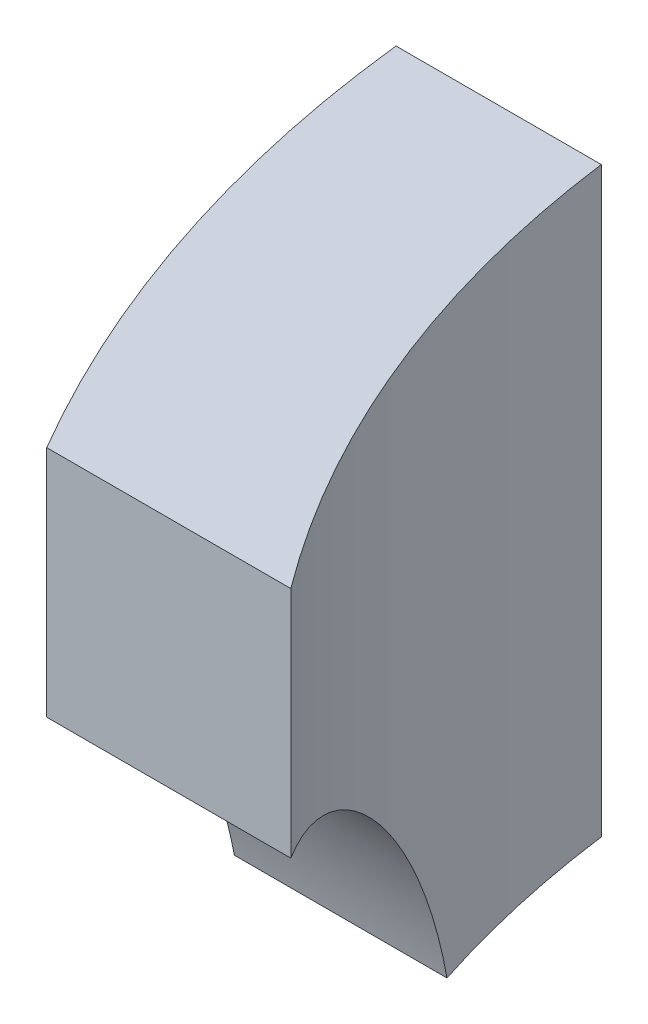
ISO-10303-21;
HEADER;
FILE_DESCRIPTION(('STEP AP214'),'2;1');
FILE_NAME('part.step','',(''),(''),'','','');
FILE_SCHEMA(('AUTOMOTIVE_DESIGN { 1 0 10303 214 1 1 1 1 }'));
ENDSEC;
DATA;
#1=APPLICATION_CONTEXT('core data for automotive mechanical design processes');
#2=APPLICATION_PROTOCOL_DEFINITION('international standard','automotive_design',2000,#1);
#3=PRODUCT_CONTEXT('',#1,'mechanical');
#4=PRODUCT('Part','Part','',(#3));
#5=PRODUCT_RELATED_PRODUCT_CATEGORY('part','',(#4));
#6=PRODUCT_DEFINITION_FORMATION('','',#4);
#7=PRODUCT_DEFINITION_CONTEXT('part definition',#1,'design');
#8=PRODUCT_DEFINITION('design','',#6,#7);
#9=PRODUCT_DEFINITION_SHAPE('','',#8);
#10=(LENGTH_UNIT() NAMED_UNIT(*) SI_UNIT(.MILLI.,.METRE.));
#11=(NAMED_UNIT(*) PLANE_ANGLE_UNIT() SI_UNIT($,.RADIAN.));
#12=(NAMED_UNIT(*) SI_UNIT($,.STERADIAN.) SOLID_ANGLE_UNIT());
#13=UNCERTAINTY_MEASURE_WITH_UNIT(LENGTH_MEASURE(1.E-05),#10,'distance_accuracy_value','');
#14=(GEOMETRIC_REPRESENTATION_CONTEXT(3) GLOBAL_UNCERTAINTY_ASSIGNED_CONTEXT((#13)) GLOBAL_UNIT_ASSIGNED_CONTEXT((#10,
#11,#12)) REPRESENTATION_CONTEXT('',''));
#15=CARTESIAN_POINT('',(0.,0.,0.));
#16=DIRECTION('',(0.,0.,1.));
#17=DIRECTION('',(1.,0.,0.));
#18=AXIS2_PLACEMENT_3D('',#15,#16,#17);
#19=CARTESIAN_POINT('',(0.,-60.,0.));
#20=DIRECTION('',(0.,1.,0.));
#21=DIRECTION('',(0.,0.,1.));
#22=AXIS2_PLACEMENT_3D('',#19,#20,#21);
#23=CYLINDRICAL_SURFACE('',#22,90.805);
#24=CARTESIAN_POINT('',(0.,-60.,0.));
#25=DIRECTION('',(0.,-1.,0.));
#26=DIRECTION('',(0.,0.,-1.));
#27=AXIS2_PLACEMENT_3D('',#24,#25,#26);
#28=CIRCLE('',#27,90.805);
#29=CARTESIAN_POINT('',(-90.252689849112,-60.,9.99999999999961));
#30=VERTEX_POINT('',#29);
#31=CARTESIAN_POINT('',(-78.3577667284712,-60.,45.8869090081963));
#32=VERTEX_POINT('',#31);
#33=EDGE_CURVE('E53',#30,#32,#28,.F.);
#34=ORIENTED_EDGE('',*,*,#33,.F.);
#35=DIRECTION('',(0.,1.,0.));
#36=VECTOR('',#35,1.);
#37=CARTESIAN_POINT('',(-90.252689849112,-100.,9.99999999999961));
#38=LINE('',#37,#36);
#39=CARTESIAN_POINT('',(-90.252689849112,-100.,9.99999999999961));
#40=VERTEX_POINT('',#39);
#41=EDGE_CURVE('E98',#40,#30,#38,.T.);
#42=ORIENTED_EDGE('',*,*,#41,.F.);
#43=CARTESIAN_POINT('',(2.26207941267376E-12,-100.,-8.74300631892311E-13));
#44=DIRECTION('',(0.,-1.,0.));
#45=DIRECTION('',(0.,0.,1.));
#46=AXIS2_PLACEMENT_3D('',#43,#44,#45);
#47=CIRCLE('',#46,90.8050000000023);
#48=CARTESIAN_POINT('',(-87.6601550745138,-100.,23.690614962727));
#49=VERTEX_POINT('',#48);
#50=EDGE_CURVE('E110',#49,#40,#47,.T.);
#51=ORIENTED_EDGE('',*,*,#50,.F.);
#52=CARTESIAN_POINT('',(-78.3577667284712,-76.0376066251599,45.8869090081963));
#53=CARTESIAN_POINT('',(-78.5924473159575,-76.1689068918217,45.4861771932687));
#54=CARTESIAN_POINT('',(-78.8228617009509,-76.3084983273187,45.0856503262618));
#55=CARTESIAN_POINT('',(-79.2749753014099,-76.6045032034185,44.2858553963328));
#56=CARTESIAN_POINT('',(-79.4966738682963,-76.7609178926845,43.8865874291163));
#57=CARTESIAN_POINT('',(-79.93123879399,-77.0908659244213,43.090034511724));
#58=CARTESIAN_POINT('',(-80.1441010131283,-77.2644071646159,42.6927505660127));
#59=CARTESIAN_POINT('',(-80.5606987495879,-77.628669644403,41.9013357120492));
#60=CARTESIAN_POINT('',(-80.7644344711998,-77.8193904991533,41.5072047333823));
#61=CARTESIAN_POINT('',(-81.3620238071811,-78.417776377688,40.3304179202884));
#62=CARTESIAN_POINT('',(-81.7420516661545,-78.8515073193961,39.5537506263202));
#63=CARTESIAN_POINT('',(-82.4642522133015,-79.7879903483694,38.0251245028361));
#64=CARTESIAN_POINT('',(-82.8064317795716,-80.2907298575056,37.2731612014305));
#65=CARTESIAN_POINT('',(-83.4541133476261,-81.3657172459826,35.7995644949122));
#66=CARTESIAN_POINT('',(-83.7594916971807,-81.9381871401374,35.0780383614937));
#67=CARTESIAN_POINT('',(-84.3328822717363,-83.1487224762524,33.6762045151858));
#68=CARTESIAN_POINT('',(-84.6008914114346,-83.7867933268575,32.9959002083003));
#69=CARTESIAN_POINT('',(-85.100587098163,-85.1243076507707,31.6848565251361));
#70=CARTESIAN_POINT('',(-85.332294366709,-85.8237157538185,31.0540889760324));
#71=CARTESIAN_POINT('',(-85.7612529753876,-87.2793457600486,29.849032109615));
#72=CARTESIAN_POINT('',(-85.9585077567818,-88.0355619781904,29.2747371540841));
#73=CARTESIAN_POINT('',(-86.3112785847532,-89.5587862752785,28.2171202605891));
#74=CARTESIAN_POINT('',(-86.4684233816406,-90.3232230496112,27.7306328623269));
#75=CARTESIAN_POINT('',(-86.7555037061851,-91.8928780923187,26.8190067726851));
#76=CARTESIAN_POINT('',(-86.8854355435854,-92.6981018733181,26.3938764041501));
#77=CARTESIAN_POINT('',(-87.1197567652052,-94.3419724243445,25.609826826792));
#78=CARTESIAN_POINT('',(-87.2241889062247,-95.1805604656519,25.2507970355623));
#79=CARTESIAN_POINT('',(-87.409530876033,-96.886051907719,24.601545085342));
#80=CARTESIAN_POINT('',(-87.4904556042024,-97.7529369840286,24.3112793641834));
#81=CARTESIAN_POINT('',(-87.5784852800884,-98.8576137884529,23.9908628374244));
#82=CARTESIAN_POINT('',(-87.5958350107837,-99.0852687247497,23.9274253555937));
#83=CARTESIAN_POINT('',(-87.6290759757658,-99.5417308559339,23.8054005587297));
#84=CARTESIAN_POINT('',(-87.6449686783639,-99.7705366401469,23.7468083668533));
#85=CARTESIAN_POINT('',(-87.6601550745138,-100.,23.690614962727));
#86=B_SPLINE_CURVE_WITH_KNOTS('',3,(#52,#53,#54,#55,#56,#57,#58,#59,#60,#61,#62,#63,#64,#65,#66,
#67,#68,#69,#70,#71,#72,#73,#74,#75,#76,#77,#78,#79,#80,#81,#82,#83,#84,#85),.UNSPECIFIED.,.F.,
.F.,(4,2,2,2,2,2,2,2,2,2,2,2,2,2,2,2,4),(0.,1.447717955692,2.89554343881256,4.34403971873127,
5.79250355880858,8.69081564008807,11.5886001483948,14.4958647087084,17.4033691586731,
20.3092078777708,23.2147561830751,25.9703463563231,28.7263099641602,31.4776202583256,
34.2271829032457,34.9380419918491,35.6481766556987),.UNSPECIFIED.);
#87=CARTESIAN_POINT('',(-78.3577667284712,-76.0376066251599,45.8869090081963));
#88=VERTEX_POINT('',#87);
#89=EDGE_CURVE('E61',#88,#49,#86,.T.);
#90=ORIENTED_EDGE('',*,*,#89,.F.);
#91=DIRECTION('',(0.,1.,0.));
#92=VECTOR('',#91,1.);
#93=CARTESIAN_POINT('',(-78.3577667284712,-60.,45.8869090081963));
#94=LINE('',#93,#92);
#95=EDGE_CURVE('E92',#88,#32,#94,.T.);
#96=ORIENTED_EDGE('',*,*,#95,.T.);
#97=EDGE_LOOP('',(#34,#42,#51,#90,#96));
#98=FACE_BOUND('',#97,.T.);
#99=ADVANCED_FACE('F37',(#98),#23,.T.);
#100=CARTESIAN_POINT('',(0.,-60.,0.));
#101=DIRECTION('',(0.,1.,0.));
#102=DIRECTION('',(0.,0.,1.));
#103=AXIS2_PLACEMENT_3D('',#100,#101,#102);
#104=CYLINDRICAL_SURFACE('',#103,76.805);
#105=DIRECTION('',(0.,1.,0.));
#106=VECTOR('',#105,1.);
#107=CARTESIAN_POINT('',(-76.1512181452142,-100.,9.99999999999961));
#108=LINE('',#107,#106);
#109=CARTESIAN_POINT('',(-76.1512181452142,-100.,9.99999999999961));
#110=VERTEX_POINT('',#109);
#111=CARTESIAN_POINT('',(-76.1512181452142,-60.,9.99999999999961));
#112=VERTEX_POINT('',#111);
#113=EDGE_CURVE('E104',#110,#112,#108,.T.);
#114=ORIENTED_EDGE('',*,*,#113,.T.);
#115=CARTESIAN_POINT('',(0.,-60.,0.));
#116=DIRECTION('',(0.,-1.,0.));
#117=DIRECTION('',(0.,0.,-1.));
#118=AXIS2_PLACEMENT_3D('',#115,#116,#117);
#119=CIRCLE('',#118,76.805);
#120=CARTESIAN_POINT('',(-61.5905805028132,-60.,45.8869090081963));
#121=VERTEX_POINT('',#120);
#122=EDGE_CURVE('E86',#112,#121,#119,.F.);
#123=ORIENTED_EDGE('',*,*,#122,.T.);
#124=DIRECTION('',(0.,1.,0.));
#125=VECTOR('',#124,1.);
#126=CARTESIAN_POINT('',(-61.5905805028132,-100.,45.8869090081963));
#127=LINE('',#126,#125);
#128=CARTESIAN_POINT('',(-61.5905805028132,-76.0376066251599,45.8869090081963));
#129=VERTEX_POINT('',#128);
#130=EDGE_CURVE('E46',#129,#121,#127,.T.);
#131=ORIENTED_EDGE('',*,*,#130,.F.);
#132=CARTESIAN_POINT('',(-61.5905805028132,-76.0376066251599,45.8869090081963));
#133=CARTESIAN_POINT('',(-61.8724879759073,-76.1615804574404,45.508541010111));
#134=CARTESIAN_POINT('',(-62.1496833209392,-76.2933266038598,45.1291894544505));
#135=CARTESIAN_POINT('',(-62.6943847469691,-76.5728008223829,44.3693623114229));
#136=CARTESIAN_POINT('',(-62.9618898947462,-76.7205304283509,43.9888866195914));
#137=CARTESIAN_POINT('',(-63.4870614976273,-77.0324861006369,43.2274810640035));
#138=CARTESIAN_POINT('',(-63.7447214748006,-77.1967227788302,42.8465510656696));
#139=CARTESIAN_POINT('',(-64.2497301445695,-77.5419306381188,42.0854950338412));
#140=CARTESIAN_POINT('',(-64.4970791274666,-77.7229013476125,41.7053689779986));
#141=CARTESIAN_POINT('',(-65.2241351289306,-78.2920296701556,40.5663838739214));
#142=CARTESIAN_POINT('',(-65.6880671570044,-78.705940658175,39.8100582990234));
#143=CARTESIAN_POINT('',(-66.5720205057861,-79.6033606792859,38.3135700821961));
#144=CARTESIAN_POINT('',(-66.9920523591591,-80.0868529517458,37.5734035971985));
#145=CARTESIAN_POINT('',(-67.789457330275,-81.1257387039277,36.1149724125224));
#146=CARTESIAN_POINT('',(-68.1666320639874,-81.6814429119866,35.3968199772308));
#147=CARTESIAN_POINT('',(-68.8762432177263,-82.8614384512383,33.9954161489857));
#148=CARTESIAN_POINT('',(-69.2086751187448,-83.4857366988525,33.3121682856973));
#149=CARTESIAN_POINT('',(-69.829301277256,-84.7989121619739,31.9907659512638));
#150=CARTESIAN_POINT('',(-70.1175475464876,-85.4877118881778,31.3525589469111));
#151=CARTESIAN_POINT('',(-70.6518906952164,-86.9259293828332,30.1291241565394));
#152=CARTESIAN_POINT('',(-70.8979927127415,-87.6753397454977,29.5438899164388));
#153=CARTESIAN_POINT('',(-71.33366024115,-89.1719885659438,28.4749941344923));
#154=CARTESIAN_POINT('',(-71.5260516137345,-89.915338511502,27.9870286320866));
#155=CARTESIAN_POINT('',(-71.8786494685781,-91.4441654789608,27.0686141988077));
#156=CARTESIAN_POINT('',(-72.0388524348975,-92.2296470910442,26.6381715528745));
#157=CARTESIAN_POINT('',(-72.3289722770888,-93.8358756386956,25.8400457182096));
#158=CARTESIAN_POINT('',(-72.4589280853882,-94.6565756126157,25.4722820178698));
#159=CARTESIAN_POINT('',(-72.6908265875386,-96.3278865694105,24.8027696314158));
#160=CARTESIAN_POINT('',(-72.7927857121498,-97.1784796764486,24.5009822462556));
#161=CARTESIAN_POINT('',(-72.9150335177527,-98.3644406386399,24.1333160888137));
#162=CARTESIAN_POINT('',(-72.9465528429963,-98.6897337640126,24.0378356742379));
#163=CARTESIAN_POINT('',(-73.0059576790096,-99.3428916675791,23.8568067477289));
#164=CARTESIAN_POINT('',(-73.0338483671424,-99.6707520581313,23.77124410451));
#165=CARTESIAN_POINT('',(-73.0599944407869,-100.,23.690614962727));
#166=B_SPLINE_CURVE_WITH_KNOTS('',3,(#132,#133,#134,#135,#136,#137,#138,#139,#140,#141,#142,
#143,#144,#145,#146,#147,#148,#149,#150,#151,#152,#153,#154,#155,#156,#157,#158,#159,#160,#161,
#162,#163,#164,#165),.UNSPECIFIED.,.F.,.F.,(4,2,2,2,2,2,2,2,2,2,2,2,2,2,2,2,4),(0.,
1.46350327731127,2.92714712556941,4.39173799686065,5.85628760534677,8.78975158938339,
11.7225101442121,14.668334326783,17.614455813495,20.5570822853487,23.4993497503075,
26.2253702261823,28.9516883036157,31.6744775693344,34.3956654459655,35.4169674751842,
36.4367959385946),.UNSPECIFIED.);
#167=CARTESIAN_POINT('',(-73.0599944407868,-100.,23.690614962727));
#168=VERTEX_POINT('',#167);
#169=EDGE_CURVE('E121',#129,#168,#166,.T.);
#170=ORIENTED_EDGE('',*,*,#169,.T.);
#171=CARTESIAN_POINT('',(2.08166817117217E-12,-100.,-8.46545056276682E-13));
#172=DIRECTION('',(0.,1.,0.));
#173=DIRECTION('',(0.,0.,1.));
#174=AXIS2_PLACEMENT_3D('',#171,#172,#173);
#175=CIRCLE('',#174,76.8050000000022);
#176=EDGE_CURVE('E91',#110,#168,#175,.T.);
#177=ORIENTED_EDGE('',*,*,#176,.F.);
#178=EDGE_LOOP('',(#114,#123,#131,#170,#177));
#179=FACE_BOUND('',#178,.T.);
#180=ADVANCED_FACE('F39',(#179),#104,.F.);
#181=CARTESIAN_POINT('',(-90.252689849112,-100.,9.99999999999961));
#182=DIRECTION('',(0.,0.,1.));
#183=DIRECTION('',(1.,0.,0.));
#184=AXIS2_PLACEMENT_3D('',#181,#182,#183);
#185=PLANE('',#184);
#186=DIRECTION('',(1.,0.,0.));
#187=VECTOR('',#186,1.);
#188=CARTESIAN_POINT('',(-90.252689849112,-60.,9.99999999999961));
#189=LINE('',#188,#187);
#190=EDGE_CURVE('E83',#30,#112,#189,.T.);
#191=ORIENTED_EDGE('',*,*,#190,.T.);
#192=ORIENTED_EDGE('',*,*,#113,.F.);
#193=DIRECTION('',(1.,0.,0.));
#194=VECTOR('',#193,1.);
#195=CARTESIAN_POINT('',(-90.252689849112,-100.,9.99999999999961));
#196=LINE('',#195,#194);
#197=EDGE_CURVE('E103',#40,#110,#196,.T.);
#198=ORIENTED_EDGE('',*,*,#197,.F.);
#199=ORIENTED_EDGE('',*,*,#41,.T.);
#200=EDGE_LOOP('',(#191,#192,#198,#199));
#201=FACE_BOUND('',#200,.T.);
#202=ADVANCED_FACE('F102',(#201),#185,.F.);
#203=CARTESIAN_POINT('',(2.08166817117217E-12,-100.,-8.46545056276682E-13));
#204=DIRECTION('',(0.,1.,0.));
#205=DIRECTION('',(0.,0.,1.));
#206=AXIS2_PLACEMENT_3D('',#203,#204,#205);
#207=PLANE('',#206);
#208=ORIENTED_EDGE('',*,*,#176,.T.);
#209=DIRECTION('',(1.,0.,0.));
#210=VECTOR('',#209,1.);
#211=CARTESIAN_POINT('',(-90.,-100.,23.690614962727));
#212=LINE('',#211,#210);
#213=EDGE_CURVE('E11',#168,#49,#212,.F.);
#214=ORIENTED_EDGE('',*,*,#213,.T.);
#215=ORIENTED_EDGE('',*,*,#50,.T.);
#216=ORIENTED_EDGE('',*,*,#197,.T.);
#217=EDGE_LOOP('',(#208,#214,#215,#216));
#218=FACE_BOUND('',#217,.T.);
#219=ADVANCED_FACE('F136',(#218),#207,.F.);
#220=CARTESIAN_POINT('',(-90.,-59.9171673050235,45.8869090081963));
#221=DIRECTION('',(0.,0.,1.));
#222=DIRECTION('',(1.,0.,0.));
#223=AXIS2_PLACEMENT_3D('',#220,#221,#222);
#224=PLANE('',#223);
#225=DIRECTION('',(1.,0.,0.));
#226=VECTOR('',#225,1.);
#227=CARTESIAN_POINT('',(-90.,-60.,45.8869090081963));
#228=LINE('',#227,#226);
#229=EDGE_CURVE('E188',#32,#121,#228,.T.);
#230=ORIENTED_EDGE('',*,*,#229,.F.);
#231=ORIENTED_EDGE('',*,*,#95,.F.);
#232=DIRECTION('',(1.,0.,0.));
#233=VECTOR('',#232,1.);
#234=CARTESIAN_POINT('',(-90.,-76.0376066251599,45.8869090081963));
#235=LINE('',#234,#233);
#236=EDGE_CURVE('E100',#88,#129,#235,.T.);
#237=ORIENTED_EDGE('',*,*,#236,.T.);
#238=ORIENTED_EDGE('',*,*,#130,.T.);
#239=EDGE_LOOP('',(#230,#231,#237,#238));
#240=FACE_BOUND('',#239,.T.);
#241=ADVANCED_FACE('F134',(#240),#224,.T.);
#242=CARTESIAN_POINT('',(-90.,-108.000167786146,56.3599898084857));
#243=DIRECTION('',(1.,0.,0.));
#244=DIRECTION('',(0.,0.,-1.));
#245=AXIS2_PLACEMENT_3D('',#242,#243,#244);
#246=CYLINDRICAL_SURFACE('',#245,33.6346657099366);
#247=ORIENTED_EDGE('',*,*,#89,.T.);
#248=ORIENTED_EDGE('',*,*,#213,.F.);
#249=ORIENTED_EDGE('',*,*,#169,.F.);
#250=ORIENTED_EDGE('',*,*,#236,.F.);
#251=EDGE_LOOP('',(#247,#248,#249,#250));
#252=FACE_BOUND('',#251,.T.);
#253=ADVANCED_FACE('F129',(#252),#246,.F.);
#254=CARTESIAN_POINT('',(-91.805,-60.,9.99999999999961));
#255=DIRECTION('',(0.,-1.,0.));
#256=DIRECTION('',(0.,0.,-1.));
#257=AXIS2_PLACEMENT_3D('',#254,#255,#256);
#258=PLANE('',#257);
#259=ORIENTED_EDGE('',*,*,#33,.T.);
#260=ORIENTED_EDGE('',*,*,#229,.T.);
#261=ORIENTED_EDGE('',*,*,#122,.F.);
#262=ORIENTED_EDGE('',*,*,#190,.F.);
#263=EDGE_LOOP('',(#259,#260,#261,#262));
#264=FACE_BOUND('',#263,.T.);
#265=ADVANCED_FACE('F84',(#264),#258,.F.);
#266=CLOSED_SHELL('',(#99,#180,#202,#219,#241,#253,#265));
#267=MANIFOLD_SOLID_BREP('B2',#266);
#268=ADVANCED_BREP_SHAPE_REPRESENTATION('',(#18,#267),#14);
#269=SHAPE_DEFINITION_REPRESENTATION(#9,#268);
ENDSEC;
END-ISO-10303-21;
